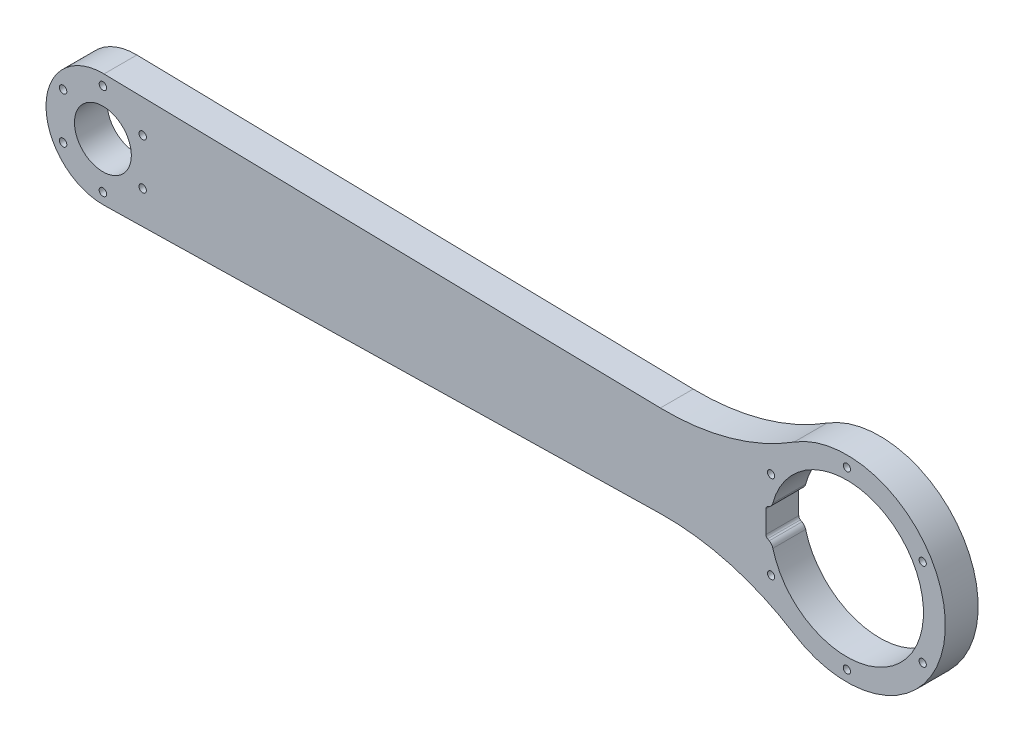
ISO-10303-21;
HEADER;
FILE_DESCRIPTION(('STEP AP214'),'2;1');
FILE_NAME('part.step','',(''),(''),'','','');
FILE_SCHEMA(('AUTOMOTIVE_DESIGN { 1 0 10303 214 1 1 1 1 }'));
ENDSEC;
DATA;
#1=APPLICATION_CONTEXT('core data for automotive mechanical design processes');
#2=APPLICATION_PROTOCOL_DEFINITION('international standard','automotive_design',2000,#1);
#3=PRODUCT_CONTEXT('',#1,'mechanical');
#4=PRODUCT('Part','Part','',(#3));
#5=PRODUCT_RELATED_PRODUCT_CATEGORY('part','',(#4));
#6=PRODUCT_DEFINITION_FORMATION('','',#4);
#7=PRODUCT_DEFINITION_CONTEXT('part definition',#1,'design');
#8=PRODUCT_DEFINITION('design','',#6,#7);
#9=PRODUCT_DEFINITION_SHAPE('','',#8);
#10=(LENGTH_UNIT() NAMED_UNIT(*) SI_UNIT(.MILLI.,.METRE.));
#11=(NAMED_UNIT(*) PLANE_ANGLE_UNIT() SI_UNIT($,.RADIAN.));
#12=(NAMED_UNIT(*) SI_UNIT($,.STERADIAN.) SOLID_ANGLE_UNIT());
#13=UNCERTAINTY_MEASURE_WITH_UNIT(LENGTH_MEASURE(1.E-05),#10,'distance_accuracy_value','');
#14=(GEOMETRIC_REPRESENTATION_CONTEXT(3) GLOBAL_UNCERTAINTY_ASSIGNED_CONTEXT((#13)) GLOBAL_UNIT_ASSIGNED_CONTEXT((#10,
#11,#12)) REPRESENTATION_CONTEXT('',''));
#15=CARTESIAN_POINT('',(0.,0.,0.));
#16=DIRECTION('',(0.,0.,1.));
#17=DIRECTION('',(1.,0.,0.));
#18=AXIS2_PLACEMENT_3D('',#15,#16,#17);
#19=CARTESIAN_POINT('',(-340.,0.,15.));
#20=DIRECTION('',(0.,0.,1.));
#21=DIRECTION('',(1.,0.,0.));
#22=AXIS2_PLACEMENT_3D('',#19,#20,#21);
#23=PLANE('',#22);
#24=CARTESIAN_POINT('',(-340.,21.,15.));
#25=DIRECTION('',(0.,0.,1.));
#26=DIRECTION('',(1.,0.,0.));
#27=AXIS2_PLACEMENT_3D('',#24,#25,#26);
#28=CIRCLE('',#27,1.69999999999996);
#29=CARTESIAN_POINT('',(-338.3,21.,15.));
#30=VERTEX_POINT('',#29);
#31=EDGE_CURVE('E432',#30,#30,#28,.T.);
#32=ORIENTED_EDGE('',*,*,#31,.F.);
#33=EDGE_LOOP('',(#32));
#34=FACE_BOUND('',#33,.T.);
#35=CARTESIAN_POINT('',(-340.,-21.,15.));
#36=DIRECTION('',(0.,0.,1.));
#37=DIRECTION('',(1.,0.,0.));
#38=AXIS2_PLACEMENT_3D('',#35,#36,#37);
#39=CIRCLE('',#38,1.69999999999996);
#40=CARTESIAN_POINT('',(-338.3,-21.,15.));
#41=VERTEX_POINT('',#40);
#42=EDGE_CURVE('E444',#41,#41,#39,.T.);
#43=ORIENTED_EDGE('',*,*,#42,.F.);
#44=EDGE_LOOP('',(#43));
#45=FACE_BOUND('',#44,.T.);
#46=CARTESIAN_POINT('',(0.,0.,15.));
#47=DIRECTION('',(0.,0.,1.));
#48=DIRECTION('',(-1.,0.,0.));
#49=AXIS2_PLACEMENT_3D('',#46,#47,#48);
#50=CIRCLE('',#49,35.);
#51=CARTESIAN_POINT('',(-33.8381250940962,-8.94322593454391,15.));
#52=VERTEX_POINT('',#51);
#53=CARTESIAN_POINT('',(-33.8381250940962,8.94322593454391,15.));
#54=VERTEX_POINT('',#53);
#55=EDGE_CURVE('E146',#52,#54,#50,.T.);
#56=ORIENTED_EDGE('',*,*,#55,.F.);
#57=CARTESIAN_POINT('',(-37.2219376035058,-9.8375485279983,15.));
#58=DIRECTION('',(0.,0.,-1.));
#59=DIRECTION('',(-1.,0.,0.));
#60=AXIS2_PLACEMENT_3D('',#57,#58,#59);
#61=CIRCLE('',#60,3.5);
#62=CARTESIAN_POINT('',(-35.5000514131056,-6.79040101806231,15.));
#63=VERTEX_POINT('',#62);
#64=EDGE_CURVE('E138',#63,#52,#61,.T.);
#65=ORIENTED_EDGE('',*,*,#64,.F.);
#66=DIRECTION('',(0.870613574267425,-0.491967482971486,0.));
#67=VECTOR('',#66,1.);
#68=CARTESIAN_POINT('',(-35.5000514131056,-6.79040101806231,15.));
#69=LINE('',#68,#67);
#70=CARTESIAN_POINT('',(-36.2379512244572,-6.37342760574069,15.));
#71=VERTEX_POINT('',#70);
#72=EDGE_CURVE('E173',#71,#63,#69,.T.);
#73=ORIENTED_EDGE('',*,*,#72,.F.);
#74=CARTESIAN_POINT('',(-35.5,-5.06750724433956,15.));
#75=DIRECTION('',(0.,0.,1.));
#76=DIRECTION('',(-1.,0.,0.));
#77=AXIS2_PLACEMENT_3D('',#74,#75,#76);
#78=CIRCLE('',#77,1.5);
#79=CARTESIAN_POINT('',(-37.,-5.06750724433956,15.));
#80=VERTEX_POINT('',#79);
#81=EDGE_CURVE('E171',#80,#71,#78,.T.);
#82=ORIENTED_EDGE('',*,*,#81,.F.);
#83=DIRECTION('',(0.,-1.,0.));
#84=VECTOR('',#83,1.);
#85=CARTESIAN_POINT('',(-37.,5.06750724433955,15.));
#86=LINE('',#85,#84);
#87=CARTESIAN_POINT('',(-37.,5.06750724433955,15.));
#88=VERTEX_POINT('',#87);
#89=EDGE_CURVE('E169',#88,#80,#86,.T.);
#90=ORIENTED_EDGE('',*,*,#89,.F.);
#91=CARTESIAN_POINT('',(-35.5,5.06750724433956,15.));
#92=DIRECTION('',(0.,0.,1.));
#93=DIRECTION('',(1.,0.,0.));
#94=AXIS2_PLACEMENT_3D('',#91,#92,#93);
#95=CIRCLE('',#94,1.5);
#96=CARTESIAN_POINT('',(-36.2379512244572,6.3734276057407,15.));
#97=VERTEX_POINT('',#96);
#98=EDGE_CURVE('E167',#97,#88,#95,.T.);
#99=ORIENTED_EDGE('',*,*,#98,.F.);
#100=DIRECTION('',(-0.870613574267423,-0.491967482971489,0.));
#101=VECTOR('',#100,1.);
#102=CARTESIAN_POINT('',(-35.5000514131056,6.79040101806231,15.));
#103=LINE('',#102,#101);
#104=CARTESIAN_POINT('',(-35.5000514131056,6.79040101806231,15.));
#105=VERTEX_POINT('',#104);
#106=EDGE_CURVE('E162',#105,#97,#103,.T.);
#107=ORIENTED_EDGE('',*,*,#106,.F.);
#108=CARTESIAN_POINT('',(-37.2219376035058,9.8375485279983,15.));
#109=DIRECTION('',(0.,0.,-1.));
#110=DIRECTION('',(-1.,0.,0.));
#111=AXIS2_PLACEMENT_3D('',#108,#109,#110);
#112=CIRCLE('',#111,3.5);
#113=EDGE_CURVE('E160',#54,#105,#112,.T.);
#114=ORIENTED_EDGE('',*,*,#113,.F.);
#115=EDGE_LOOP('',(#56,#65,#73,#82,#90,#99,#107,#114));
#116=FACE_BOUND('',#115,.T.);
#117=CARTESIAN_POINT('',(-358.186533479473,10.5,15.));
#118=DIRECTION('',(0.,0.,1.));
#119=DIRECTION('',(1.,0.,0.));
#120=AXIS2_PLACEMENT_3D('',#117,#118,#119);
#121=CIRCLE('',#120,1.69999999999996);
#122=CARTESIAN_POINT('',(-356.486533479473,10.5,15.));
#123=VERTEX_POINT('',#122);
#124=EDGE_CURVE('E206',#123,#123,#121,.T.);
#125=ORIENTED_EDGE('',*,*,#124,.F.);
#126=EDGE_LOOP('',(#125));
#127=FACE_BOUND('',#126,.T.);
#128=CARTESIAN_POINT('',(-34.6410161513775,-20.,15.));
#129=DIRECTION('',(0.,0.,1.));
#130=DIRECTION('',(1.,0.,0.));
#131=AXIS2_PLACEMENT_3D('',#128,#129,#130);
#132=CIRCLE('',#131,1.64999999999994);
#133=CARTESIAN_POINT('',(-32.9910161513776,-20.,15.));
#134=VERTEX_POINT('',#133);
#135=EDGE_CURVE('E218',#134,#134,#132,.T.);
#136=ORIENTED_EDGE('',*,*,#135,.F.);
#137=EDGE_LOOP('',(#136));
#138=FACE_BOUND('',#137,.T.);
#139=CARTESIAN_POINT('',(4.21971692985525E-13,-40.,15.));
#140=DIRECTION('',(0.,0.,1.));
#141=DIRECTION('',(1.,0.,0.));
#142=AXIS2_PLACEMENT_3D('',#139,#140,#141);
#143=CIRCLE('',#142,1.65);
#144=CARTESIAN_POINT('',(1.65000000000042,-40.,15.));
#145=VERTEX_POINT('',#144);
#146=EDGE_CURVE('E230',#145,#145,#143,.T.);
#147=ORIENTED_EDGE('',*,*,#146,.F.);
#148=EDGE_LOOP('',(#147));
#149=FACE_BOUND('',#148,.T.);
#150=CARTESIAN_POINT('',(34.6410161513775,20.,15.));
#151=DIRECTION('',(0.,0.,1.));
#152=DIRECTION('',(1.,0.,0.));
#153=AXIS2_PLACEMENT_3D('',#150,#151,#152);
#154=CIRCLE('',#153,1.65);
#155=CARTESIAN_POINT('',(36.2910161513775,20.,15.));
#156=VERTEX_POINT('',#155);
#157=EDGE_CURVE('E242',#156,#156,#154,.T.);
#158=ORIENTED_EDGE('',*,*,#157,.F.);
#159=EDGE_LOOP('',(#158));
#160=FACE_BOUND('',#159,.T.);
#161=CARTESIAN_POINT('',(-340.,0.,15.));
#162=DIRECTION('',(0.,0.,1.));
#163=DIRECTION('',(1.,0.,0.));
#164=AXIS2_PLACEMENT_3D('',#161,#162,#163);
#165=CIRCLE('',#164,26.);
#166=CARTESIAN_POINT('',(-339.479111623952,25.9947816936342,15.));
#167=VERTEX_POINT('',#166);
#168=CARTESIAN_POINT('',(-339.479111623952,-25.9947816936342,15.));
#169=VERTEX_POINT('',#168);
#170=EDGE_CURVE('E254',#167,#169,#165,.T.);
#171=ORIENTED_EDGE('',*,*,#170,.T.);
#172=DIRECTION('',(0.999799295909007,0.0200341683095325,0.));
#173=VECTOR('',#172,1.);
#174=CARTESIAN_POINT('',(-85.2451135374465,-20.9003925212157,15.));
#175=LINE('',#174,#173);
#176=CARTESIAN_POINT('',(-85.2451135374465,-20.9003925212157,15.));
#177=VERTEX_POINT('',#176);
#178=EDGE_CURVE('E257',#169,#177,#175,.T.);
#179=ORIENTED_EDGE('',*,*,#178,.T.);
#180=CARTESIAN_POINT('',(-83.0413550233979,-130.878315071206,15.));
#181=DIRECTION('',(0.,0.,-1.));
#182=DIRECTION('',(-1.,0.,0.));
#183=AXIS2_PLACEMENT_3D('',#180,#181,#182);
#184=CIRCLE('',#183,110.);
#185=CARTESIAN_POINT('',(-24.1087804906639,-37.9969301819631,15.));
#186=VERTEX_POINT('',#185);
#187=EDGE_CURVE('E260',#177,#186,#184,.T.);
#188=ORIENTED_EDGE('',*,*,#187,.T.);
#189=CARTESIAN_POINT('',(0.,0.,15.));
#190=DIRECTION('',(0.,0.,1.));
#191=DIRECTION('',(-1.,0.,0.));
#192=AXIS2_PLACEMENT_3D('',#189,#190,#191);
#193=CIRCLE('',#192,45.);
#194=CARTESIAN_POINT('',(-24.1087804906639,37.9969301819632,15.));
#195=VERTEX_POINT('',#194);
#196=EDGE_CURVE('E262',#186,#195,#193,.T.);
#197=ORIENTED_EDGE('',*,*,#196,.T.);
#198=CARTESIAN_POINT('',(-83.0413550233979,130.878315071206,15.));
#199=DIRECTION('',(0.,0.,-1.));
#200=DIRECTION('',(-1.,0.,0.));
#201=AXIS2_PLACEMENT_3D('',#198,#199,#200);
#202=CIRCLE('',#201,110.);
#203=CARTESIAN_POINT('',(-85.2451135374464,20.9003925212157,15.));
#204=VERTEX_POINT('',#203);
#205=EDGE_CURVE('E264',#195,#204,#202,.T.);
#206=ORIENTED_EDGE('',*,*,#205,.T.);
#207=DIRECTION('',(-0.999799295909007,0.0200341683095325,0.));
#208=VECTOR('',#207,1.);
#209=CARTESIAN_POINT('',(-85.2451135374465,20.9003925212157,15.));
#210=LINE('',#209,#208);
#211=EDGE_CURVE('E266',#204,#167,#210,.T.);
#212=ORIENTED_EDGE('',*,*,#211,.T.);
#213=EDGE_LOOP('',(#171,#179,#188,#197,#206,#212));
#214=FACE_BOUND('',#213,.T.);
#215=CARTESIAN_POINT('',(-1.39107268084413E-13,40.,15.));
#216=DIRECTION('',(0.,0.,1.));
#217=DIRECTION('',(1.,0.,0.));
#218=AXIS2_PLACEMENT_3D('',#215,#216,#217);
#219=CIRCLE('',#218,1.65);
#220=CARTESIAN_POINT('',(1.64999999999986,40.,15.));
#221=VERTEX_POINT('',#220);
#222=EDGE_CURVE('E248',#221,#221,#219,.T.);
#223=ORIENTED_EDGE('',*,*,#222,.F.);
#224=EDGE_LOOP('',(#223));
#225=FACE_BOUND('',#224,.T.);
#226=CARTESIAN_POINT('',(34.6410161513778,-19.9999999999996,15.));
#227=DIRECTION('',(0.,0.,1.));
#228=DIRECTION('',(1.,0.,0.));
#229=AXIS2_PLACEMENT_3D('',#226,#227,#228);
#230=CIRCLE('',#229,1.65);
#231=CARTESIAN_POINT('',(36.2910161513778,-19.9999999999996,15.));
#232=VERTEX_POINT('',#231);
#233=EDGE_CURVE('E236',#232,#232,#230,.T.);
#234=ORIENTED_EDGE('',*,*,#233,.F.);
#235=EDGE_LOOP('',(#234));
#236=FACE_BOUND('',#235,.T.);
#237=CARTESIAN_POINT('',(-34.6410161513777,20.,15.));
#238=DIRECTION('',(0.,0.,1.));
#239=DIRECTION('',(1.,0.,0.));
#240=AXIS2_PLACEMENT_3D('',#237,#238,#239);
#241=CIRCLE('',#240,1.65);
#242=CARTESIAN_POINT('',(-32.9910161513777,20.,15.));
#243=VERTEX_POINT('',#242);
#244=EDGE_CURVE('E224',#243,#243,#241,.T.);
#245=ORIENTED_EDGE('',*,*,#244,.F.);
#246=EDGE_LOOP('',(#245));
#247=FACE_BOUND('',#246,.T.);
#248=CARTESIAN_POINT('',(-340.,0.,15.));
#249=DIRECTION('',(0.,0.,1.));
#250=DIRECTION('',(1.,0.,0.));
#251=AXIS2_PLACEMENT_3D('',#248,#249,#250);
#252=CIRCLE('',#251,13.);
#253=CARTESIAN_POINT('',(-327.,0.,15.));
#254=VERTEX_POINT('',#253);
#255=EDGE_CURVE('E212',#254,#254,#252,.T.);
#256=ORIENTED_EDGE('',*,*,#255,.F.);
#257=EDGE_LOOP('',(#256));
#258=FACE_BOUND('',#257,.T.);
#259=CARTESIAN_POINT('',(-358.186533479473,-10.5,15.));
#260=DIRECTION('',(0.,0.,1.));
#261=DIRECTION('',(1.,0.,0.));
#262=AXIS2_PLACEMENT_3D('',#259,#260,#261);
#263=CIRCLE('',#262,1.69999999999996);
#264=CARTESIAN_POINT('',(-356.486533479473,-10.5,15.));
#265=VERTEX_POINT('',#264);
#266=EDGE_CURVE('E176',#265,#265,#263,.T.);
#267=ORIENTED_EDGE('',*,*,#266,.F.);
#268=EDGE_LOOP('',(#267));
#269=FACE_BOUND('',#268,.T.);
#270=CARTESIAN_POINT('',(-321.813466520527,-10.5,15.));
#271=DIRECTION('',(0.,0.,1.));
#272=DIRECTION('',(1.,0.,0.));
#273=AXIS2_PLACEMENT_3D('',#270,#271,#272);
#274=CIRCLE('',#273,1.69999999999996);
#275=CARTESIAN_POINT('',(-320.113466520527,-10.5,15.));
#276=VERTEX_POINT('',#275);
#277=EDGE_CURVE('E438',#276,#276,#274,.T.);
#278=ORIENTED_EDGE('',*,*,#277,.F.);
#279=EDGE_LOOP('',(#278));
#280=FACE_BOUND('',#279,.T.);
#281=CARTESIAN_POINT('',(-321.813466520527,10.5000000000001,15.));
#282=DIRECTION('',(0.,0.,1.));
#283=DIRECTION('',(1.,0.,0.));
#284=AXIS2_PLACEMENT_3D('',#281,#282,#283);
#285=CIRCLE('',#284,1.69999999999996);
#286=CARTESIAN_POINT('',(-320.113466520527,10.5000000000001,15.));
#287=VERTEX_POINT('',#286);
#288=EDGE_CURVE('E423',#287,#287,#285,.T.);
#289=ORIENTED_EDGE('',*,*,#288,.F.);
#290=EDGE_LOOP('',(#289));
#291=FACE_BOUND('',#290,.T.);
#292=ADVANCED_FACE('F37',(#34,#45,#116,#127,#138,#149,#160,#214,#225,#236,#247,#258,#269,#280,
#291),#23,.T.);
#293=CARTESIAN_POINT('',(-340.,0.,0.));
#294=DIRECTION('',(0.,0.,1.));
#295=DIRECTION('',(1.,0.,0.));
#296=AXIS2_PLACEMENT_3D('',#293,#294,#295);
#297=PLANE('',#296);
#298=CARTESIAN_POINT('',(-358.186533479473,10.5,0.));
#299=DIRECTION('',(0.,0.,1.));
#300=DIRECTION('',(1.,0.,0.));
#301=AXIS2_PLACEMENT_3D('',#298,#299,#300);
#302=CIRCLE('',#301,1.69999999999996);
#303=CARTESIAN_POINT('',(-356.486533479473,10.5,0.));
#304=VERTEX_POINT('',#303);
#305=EDGE_CURVE('E154',#304,#304,#302,.T.);
#306=ORIENTED_EDGE('',*,*,#305,.T.);
#307=EDGE_LOOP('',(#306));
#308=FACE_BOUND('',#307,.T.);
#309=CARTESIAN_POINT('',(-340.,0.,0.));
#310=DIRECTION('',(0.,0.,1.));
#311=DIRECTION('',(1.,0.,0.));
#312=AXIS2_PLACEMENT_3D('',#309,#310,#311);
#313=CIRCLE('',#312,13.);
#314=CARTESIAN_POINT('',(-327.,0.,0.));
#315=VERTEX_POINT('',#314);
#316=EDGE_CURVE('E209',#315,#315,#313,.T.);
#317=ORIENTED_EDGE('',*,*,#316,.T.);
#318=EDGE_LOOP('',(#317));
#319=FACE_BOUND('',#318,.T.);
#320=CARTESIAN_POINT('',(-34.6410161513775,-20.,0.));
#321=DIRECTION('',(0.,0.,1.));
#322=DIRECTION('',(1.,0.,0.));
#323=AXIS2_PLACEMENT_3D('',#320,#321,#322);
#324=CIRCLE('',#323,1.64999999999994);
#325=CARTESIAN_POINT('',(-32.9910161513776,-20.,0.));
#326=VERTEX_POINT('',#325);
#327=EDGE_CURVE('E215',#326,#326,#324,.T.);
#328=ORIENTED_EDGE('',*,*,#327,.T.);
#329=EDGE_LOOP('',(#328));
#330=FACE_BOUND('',#329,.T.);
#331=CARTESIAN_POINT('',(-34.6410161513777,20.,0.));
#332=DIRECTION('',(0.,0.,1.));
#333=DIRECTION('',(1.,0.,0.));
#334=AXIS2_PLACEMENT_3D('',#331,#332,#333);
#335=CIRCLE('',#334,1.65);
#336=CARTESIAN_POINT('',(-32.9910161513777,20.,0.));
#337=VERTEX_POINT('',#336);
#338=EDGE_CURVE('E221',#337,#337,#335,.T.);
#339=ORIENTED_EDGE('',*,*,#338,.T.);
#340=EDGE_LOOP('',(#339));
#341=FACE_BOUND('',#340,.T.);
#342=CARTESIAN_POINT('',(4.21971692985525E-13,-40.,0.));
#343=DIRECTION('',(0.,0.,1.));
#344=DIRECTION('',(1.,0.,0.));
#345=AXIS2_PLACEMENT_3D('',#342,#343,#344);
#346=CIRCLE('',#345,1.65);
#347=CARTESIAN_POINT('',(1.65000000000042,-40.,0.));
#348=VERTEX_POINT('',#347);
#349=EDGE_CURVE('E227',#348,#348,#346,.T.);
#350=ORIENTED_EDGE('',*,*,#349,.T.);
#351=EDGE_LOOP('',(#350));
#352=FACE_BOUND('',#351,.T.);
#353=CARTESIAN_POINT('',(34.6410161513778,-19.9999999999996,0.));
#354=DIRECTION('',(0.,0.,1.));
#355=DIRECTION('',(1.,0.,0.));
#356=AXIS2_PLACEMENT_3D('',#353,#354,#355);
#357=CIRCLE('',#356,1.65);
#358=CARTESIAN_POINT('',(36.2910161513778,-19.9999999999996,0.));
#359=VERTEX_POINT('',#358);
#360=EDGE_CURVE('E233',#359,#359,#357,.T.);
#361=ORIENTED_EDGE('',*,*,#360,.T.);
#362=EDGE_LOOP('',(#361));
#363=FACE_BOUND('',#362,.T.);
#364=CARTESIAN_POINT('',(34.6410161513775,20.,0.));
#365=DIRECTION('',(0.,0.,1.));
#366=DIRECTION('',(1.,0.,0.));
#367=AXIS2_PLACEMENT_3D('',#364,#365,#366);
#368=CIRCLE('',#367,1.65);
#369=CARTESIAN_POINT('',(36.2910161513775,20.,0.));
#370=VERTEX_POINT('',#369);
#371=EDGE_CURVE('E239',#370,#370,#368,.T.);
#372=ORIENTED_EDGE('',*,*,#371,.T.);
#373=EDGE_LOOP('',(#372));
#374=FACE_BOUND('',#373,.T.);
#375=CARTESIAN_POINT('',(-1.39107268084413E-13,40.,0.));
#376=DIRECTION('',(0.,0.,1.));
#377=DIRECTION('',(1.,0.,0.));
#378=AXIS2_PLACEMENT_3D('',#375,#376,#377);
#379=CIRCLE('',#378,1.65);
#380=CARTESIAN_POINT('',(1.64999999999986,40.,0.));
#381=VERTEX_POINT('',#380);
#382=EDGE_CURVE('E245',#381,#381,#379,.T.);
#383=ORIENTED_EDGE('',*,*,#382,.T.);
#384=EDGE_LOOP('',(#383));
#385=FACE_BOUND('',#384,.T.);
#386=CARTESIAN_POINT('',(-340.,0.,0.));
#387=DIRECTION('',(0.,0.,1.));
#388=DIRECTION('',(1.,0.,0.));
#389=AXIS2_PLACEMENT_3D('',#386,#387,#388);
#390=CIRCLE('',#389,26.);
#391=CARTESIAN_POINT('',(-339.479111623952,25.9947816936342,0.));
#392=VERTEX_POINT('',#391);
#393=CARTESIAN_POINT('',(-339.479111623952,-25.9947816936342,0.));
#394=VERTEX_POINT('',#393);
#395=EDGE_CURVE('E251',#392,#394,#390,.T.);
#396=ORIENTED_EDGE('',*,*,#395,.F.);
#397=DIRECTION('',(-0.999799295909007,0.0200341683095325,0.));
#398=VECTOR('',#397,1.);
#399=CARTESIAN_POINT('',(-85.2451135374465,20.9003925212157,0.));
#400=LINE('',#399,#398);
#401=CARTESIAN_POINT('',(-85.2451135374464,20.9003925212157,0.));
#402=VERTEX_POINT('',#401);
#403=EDGE_CURVE('E258',#402,#392,#400,.T.);
#404=ORIENTED_EDGE('',*,*,#403,.F.);
#405=CARTESIAN_POINT('',(-83.0413550233979,130.878315071206,0.));
#406=DIRECTION('',(0.,0.,-1.));
#407=DIRECTION('',(-1.,0.,0.));
#408=AXIS2_PLACEMENT_3D('',#405,#406,#407);
#409=CIRCLE('',#408,110.);
#410=CARTESIAN_POINT('',(-24.1087804906639,37.9969301819632,0.));
#411=VERTEX_POINT('',#410);
#412=EDGE_CURVE('E277',#411,#402,#409,.T.);
#413=ORIENTED_EDGE('',*,*,#412,.F.);
#414=CARTESIAN_POINT('',(0.,0.,0.));
#415=DIRECTION('',(0.,0.,1.));
#416=DIRECTION('',(-1.,0.,0.));
#417=AXIS2_PLACEMENT_3D('',#414,#415,#416);
#418=CIRCLE('',#417,45.);
#419=CARTESIAN_POINT('',(-24.1087804906639,-37.9969301819631,0.));
#420=VERTEX_POINT('',#419);
#421=EDGE_CURVE('E275',#420,#411,#418,.T.);
#422=ORIENTED_EDGE('',*,*,#421,.F.);
#423=CARTESIAN_POINT('',(-83.0413550233979,-130.878315071206,0.));
#424=DIRECTION('',(0.,0.,-1.));
#425=DIRECTION('',(-1.,0.,0.));
#426=AXIS2_PLACEMENT_3D('',#423,#424,#425);
#427=CIRCLE('',#426,110.);
#428=CARTESIAN_POINT('',(-85.2451135374465,-20.9003925212157,0.));
#429=VERTEX_POINT('',#428);
#430=EDGE_CURVE('E273',#429,#420,#427,.T.);
#431=ORIENTED_EDGE('',*,*,#430,.F.);
#432=DIRECTION('',(0.999799295909007,0.0200341683095325,0.));
#433=VECTOR('',#432,1.);
#434=CARTESIAN_POINT('',(-85.2451135374465,-20.9003925212157,0.));
#435=LINE('',#434,#433);
#436=EDGE_CURVE('E271',#394,#429,#435,.T.);
#437=ORIENTED_EDGE('',*,*,#436,.F.);
#438=EDGE_LOOP('',(#396,#404,#413,#422,#431,#437));
#439=FACE_BOUND('',#438,.T.);
#440=CARTESIAN_POINT('',(-37.2219376035058,-9.8375485279983,0.));
#441=DIRECTION('',(0.,0.,-1.));
#442=DIRECTION('',(-1.,0.,0.));
#443=AXIS2_PLACEMENT_3D('',#440,#441,#442);
#444=CIRCLE('',#443,3.5);
#445=CARTESIAN_POINT('',(-35.5000514131056,-6.7904010180623,0.));
#446=VERTEX_POINT('',#445);
#447=CARTESIAN_POINT('',(-33.8381250940962,-8.94322593454391,0.));
#448=VERTEX_POINT('',#447);
#449=EDGE_CURVE('E60',#446,#448,#444,.T.);
#450=ORIENTED_EDGE('',*,*,#449,.T.);
#451=CARTESIAN_POINT('',(0.,0.,0.));
#452=DIRECTION('',(0.,0.,1.));
#453=DIRECTION('',(-1.,0.,0.));
#454=AXIS2_PLACEMENT_3D('',#451,#452,#453);
#455=CIRCLE('',#454,35.);
#456=CARTESIAN_POINT('',(-33.8381250940962,8.94322593454391,0.));
#457=VERTEX_POINT('',#456);
#458=EDGE_CURVE('E153',#448,#457,#455,.T.);
#459=ORIENTED_EDGE('',*,*,#458,.T.);
#460=CARTESIAN_POINT('',(-37.2219376035058,9.8375485279983,0.));
#461=DIRECTION('',(0.,0.,-1.));
#462=DIRECTION('',(-1.,0.,0.));
#463=AXIS2_PLACEMENT_3D('',#460,#461,#462);
#464=CIRCLE('',#463,3.5);
#465=CARTESIAN_POINT('',(-35.5000514131056,6.79040101806231,0.));
#466=VERTEX_POINT('',#465);
#467=EDGE_CURVE('E178',#457,#466,#464,.T.);
#468=ORIENTED_EDGE('',*,*,#467,.T.);
#469=DIRECTION('',(-0.870613574267423,-0.491967482971489,0.));
#470=VECTOR('',#469,1.);
#471=CARTESIAN_POINT('',(-35.5000514131056,6.79040101806231,0.));
#472=LINE('',#471,#470);
#473=CARTESIAN_POINT('',(-36.2379512244572,6.3734276057407,0.));
#474=VERTEX_POINT('',#473);
#475=EDGE_CURVE('E181',#466,#474,#472,.T.);
#476=ORIENTED_EDGE('',*,*,#475,.T.);
#477=CARTESIAN_POINT('',(-35.5,5.06750724433956,0.));
#478=DIRECTION('',(0.,0.,1.));
#479=DIRECTION('',(1.,0.,0.));
#480=AXIS2_PLACEMENT_3D('',#477,#478,#479);
#481=CIRCLE('',#480,1.5);
#482=CARTESIAN_POINT('',(-37.,5.06750724433955,0.));
#483=VERTEX_POINT('',#482);
#484=EDGE_CURVE('E184',#474,#483,#481,.T.);
#485=ORIENTED_EDGE('',*,*,#484,.T.);
#486=DIRECTION('',(0.,-1.,0.));
#487=VECTOR('',#486,1.);
#488=CARTESIAN_POINT('',(-37.,5.06750724433955,0.));
#489=LINE('',#488,#487);
#490=CARTESIAN_POINT('',(-37.,-5.06750724433956,0.));
#491=VERTEX_POINT('',#490);
#492=EDGE_CURVE('E187',#483,#491,#489,.T.);
#493=ORIENTED_EDGE('',*,*,#492,.T.);
#494=CARTESIAN_POINT('',(-35.5,-5.06750724433956,0.));
#495=DIRECTION('',(0.,0.,1.));
#496=DIRECTION('',(-1.,0.,0.));
#497=AXIS2_PLACEMENT_3D('',#494,#495,#496);
#498=CIRCLE('',#497,1.5);
#499=CARTESIAN_POINT('',(-36.2379512244572,-6.3734276057407,0.));
#500=VERTEX_POINT('',#499);
#501=EDGE_CURVE('E190',#491,#500,#498,.T.);
#502=ORIENTED_EDGE('',*,*,#501,.T.);
#503=DIRECTION('',(0.870613574267425,-0.491967482971486,0.));
#504=VECTOR('',#503,1.);
#505=CARTESIAN_POINT('',(-35.5000514131056,-6.79040101806231,0.));
#506=LINE('',#505,#504);
#507=EDGE_CURVE('E147',#500,#446,#506,.T.);
#508=ORIENTED_EDGE('',*,*,#507,.T.);
#509=EDGE_LOOP('',(#450,#459,#468,#476,#485,#493,#502,#508));
#510=FACE_BOUND('',#509,.T.);
#511=CARTESIAN_POINT('',(-358.186533479473,-10.5,0.));
#512=DIRECTION('',(0.,0.,1.));
#513=DIRECTION('',(1.,0.,0.));
#514=AXIS2_PLACEMENT_3D('',#511,#512,#513);
#515=CIRCLE('',#514,1.69999999999996);
#516=CARTESIAN_POINT('',(-356.486533479473,-10.5,0.));
#517=VERTEX_POINT('',#516);
#518=EDGE_CURVE('E447',#517,#517,#515,.T.);
#519=ORIENTED_EDGE('',*,*,#518,.T.);
#520=EDGE_LOOP('',(#519));
#521=FACE_BOUND('',#520,.T.);
#522=CARTESIAN_POINT('',(-340.,-21.,0.));
#523=DIRECTION('',(0.,0.,1.));
#524=DIRECTION('',(1.,0.,0.));
#525=AXIS2_PLACEMENT_3D('',#522,#523,#524);
#526=CIRCLE('',#525,1.69999999999996);
#527=CARTESIAN_POINT('',(-338.3,-21.,0.));
#528=VERTEX_POINT('',#527);
#529=EDGE_CURVE('E441',#528,#528,#526,.T.);
#530=ORIENTED_EDGE('',*,*,#529,.T.);
#531=EDGE_LOOP('',(#530));
#532=FACE_BOUND('',#531,.T.);
#533=CARTESIAN_POINT('',(-321.813466520527,-10.5,0.));
#534=DIRECTION('',(0.,0.,1.));
#535=DIRECTION('',(1.,0.,0.));
#536=AXIS2_PLACEMENT_3D('',#533,#534,#535);
#537=CIRCLE('',#536,1.69999999999996);
#538=CARTESIAN_POINT('',(-320.113466520527,-10.5,0.));
#539=VERTEX_POINT('',#538);
#540=EDGE_CURVE('E435',#539,#539,#537,.T.);
#541=ORIENTED_EDGE('',*,*,#540,.T.);
#542=EDGE_LOOP('',(#541));
#543=FACE_BOUND('',#542,.T.);
#544=CARTESIAN_POINT('',(-340.,21.,0.));
#545=DIRECTION('',(0.,0.,1.));
#546=DIRECTION('',(1.,0.,0.));
#547=AXIS2_PLACEMENT_3D('',#544,#545,#546);
#548=CIRCLE('',#547,1.69999999999996);
#549=CARTESIAN_POINT('',(-338.3,21.,0.));
#550=VERTEX_POINT('',#549);
#551=EDGE_CURVE('E429',#550,#550,#548,.T.);
#552=ORIENTED_EDGE('',*,*,#551,.T.);
#553=EDGE_LOOP('',(#552));
#554=FACE_BOUND('',#553,.T.);
#555=CARTESIAN_POINT('',(-321.813466520527,10.5000000000001,0.));
#556=DIRECTION('',(0.,0.,1.));
#557=DIRECTION('',(1.,0.,0.));
#558=AXIS2_PLACEMENT_3D('',#555,#556,#557);
#559=CIRCLE('',#558,1.69999999999996);
#560=CARTESIAN_POINT('',(-320.113466520527,10.5000000000001,0.));
#561=VERTEX_POINT('',#560);
#562=EDGE_CURVE('E426',#561,#561,#559,.T.);
#563=ORIENTED_EDGE('',*,*,#562,.T.);
#564=EDGE_LOOP('',(#563));
#565=FACE_BOUND('',#564,.T.);
#566=ADVANCED_FACE('F301',(#308,#319,#330,#341,#352,#363,#374,#385,#439,#510,#521,#532,#543,
#554,#565),#297,.F.);
#567=CARTESIAN_POINT('',(-340.,0.,15.));
#568=DIRECTION('',(0.,0.,-1.));
#569=DIRECTION('',(-1.,0.,0.));
#570=AXIS2_PLACEMENT_3D('',#567,#568,#569);
#571=CYLINDRICAL_SURFACE('',#570,26.);
#572=ORIENTED_EDGE('',*,*,#395,.T.);
#573=DIRECTION('',(0.,0.,-1.));
#574=VECTOR('',#573,1.);
#575=CARTESIAN_POINT('',(-339.479111623952,-25.9947816936342,15.));
#576=LINE('',#575,#574);
#577=EDGE_CURVE('E11',#169,#394,#576,.T.);
#578=ORIENTED_EDGE('',*,*,#577,.F.);
#579=ORIENTED_EDGE('',*,*,#170,.F.);
#580=DIRECTION('',(0.,0.,-1.));
#581=VECTOR('',#580,1.);
#582=CARTESIAN_POINT('',(-339.479111623952,25.9947816936342,15.));
#583=LINE('',#582,#581);
#584=EDGE_CURVE('E268',#167,#392,#583,.T.);
#585=ORIENTED_EDGE('',*,*,#584,.T.);
#586=EDGE_LOOP('',(#572,#578,#579,#585));
#587=FACE_BOUND('',#586,.T.);
#588=ADVANCED_FACE('F39',(#587),#571,.T.);
#589=CARTESIAN_POINT('',(-85.2451135374465,-20.9003925212157,15.));
#590=DIRECTION('',(-0.0200341683095325,0.999799295909007,0.));
#591=DIRECTION('',(-0.999799295909007,-0.0200341683095325,0.));
#592=AXIS2_PLACEMENT_3D('',#589,#590,#591);
#593=PLANE('',#592);
#594=ORIENTED_EDGE('',*,*,#436,.T.);
#595=DIRECTION('',(0.,0.,-1.));
#596=VECTOR('',#595,1.);
#597=CARTESIAN_POINT('',(-85.2451135374465,-20.9003925212157,15.));
#598=LINE('',#597,#596);
#599=EDGE_CURVE('E45',#177,#429,#598,.T.);
#600=ORIENTED_EDGE('',*,*,#599,.F.);
#601=ORIENTED_EDGE('',*,*,#178,.F.);
#602=ORIENTED_EDGE('',*,*,#577,.T.);
#603=EDGE_LOOP('',(#594,#600,#601,#602));
#604=FACE_BOUND('',#603,.T.);
#605=ADVANCED_FACE('F319',(#604),#593,.F.);
#606=CARTESIAN_POINT('',(-83.0413550233979,-130.878315071206,15.));
#607=DIRECTION('',(0.,0.,-1.));
#608=DIRECTION('',(-1.,0.,0.));
#609=AXIS2_PLACEMENT_3D('',#606,#607,#608);
#610=CYLINDRICAL_SURFACE('',#609,110.);
#611=ORIENTED_EDGE('',*,*,#430,.T.);
#612=DIRECTION('',(0.,0.,-1.));
#613=VECTOR('',#612,1.);
#614=CARTESIAN_POINT('',(-24.1087804906639,-37.9969301819631,15.));
#615=LINE('',#614,#613);
#616=EDGE_CURVE('E288',#186,#420,#615,.T.);
#617=ORIENTED_EDGE('',*,*,#616,.F.);
#618=ORIENTED_EDGE('',*,*,#187,.F.);
#619=ORIENTED_EDGE('',*,*,#599,.T.);
#620=EDGE_LOOP('',(#611,#617,#618,#619));
#621=FACE_BOUND('',#620,.T.);
#622=ADVANCED_FACE('F295',(#621),#610,.F.);
#623=CARTESIAN_POINT('',(0.,0.,15.));
#624=DIRECTION('',(0.,0.,-1.));
#625=DIRECTION('',(-1.,0.,0.));
#626=AXIS2_PLACEMENT_3D('',#623,#624,#625);
#627=CYLINDRICAL_SURFACE('',#626,45.);
#628=ORIENTED_EDGE('',*,*,#421,.T.);
#629=DIRECTION('',(0.,0.,-1.));
#630=VECTOR('',#629,1.);
#631=CARTESIAN_POINT('',(-24.1087804906639,37.9969301819632,15.));
#632=LINE('',#631,#630);
#633=EDGE_CURVE('E285',#195,#411,#632,.T.);
#634=ORIENTED_EDGE('',*,*,#633,.F.);
#635=ORIENTED_EDGE('',*,*,#196,.F.);
#636=ORIENTED_EDGE('',*,*,#616,.T.);
#637=EDGE_LOOP('',(#628,#634,#635,#636));
#638=FACE_BOUND('',#637,.T.);
#639=ADVANCED_FACE('F307',(#638),#627,.T.);
#640=CARTESIAN_POINT('',(-83.0413550233979,130.878315071206,15.));
#641=DIRECTION('',(0.,0.,-1.));
#642=DIRECTION('',(-1.,0.,0.));
#643=AXIS2_PLACEMENT_3D('',#640,#641,#642);
#644=CYLINDRICAL_SURFACE('',#643,110.);
#645=ORIENTED_EDGE('',*,*,#412,.T.);
#646=DIRECTION('',(0.,0.,-1.));
#647=VECTOR('',#646,1.);
#648=CARTESIAN_POINT('',(-85.2451135374464,20.9003925212157,15.));
#649=LINE('',#648,#647);
#650=EDGE_CURVE('E282',#204,#402,#649,.T.);
#651=ORIENTED_EDGE('',*,*,#650,.F.);
#652=ORIENTED_EDGE('',*,*,#205,.F.);
#653=ORIENTED_EDGE('',*,*,#633,.T.);
#654=EDGE_LOOP('',(#645,#651,#652,#653));
#655=FACE_BOUND('',#654,.T.);
#656=ADVANCED_FACE('F311',(#655),#644,.F.);
#657=CARTESIAN_POINT('',(-85.2451135374465,20.9003925212157,15.));
#658=DIRECTION('',(-0.0200341683095325,-0.999799295909007,0.));
#659=DIRECTION('',(0.999799295909007,-0.0200341683095325,0.));
#660=AXIS2_PLACEMENT_3D('',#657,#658,#659);
#661=PLANE('',#660);
#662=ORIENTED_EDGE('',*,*,#403,.T.);
#663=ORIENTED_EDGE('',*,*,#584,.F.);
#664=ORIENTED_EDGE('',*,*,#211,.F.);
#665=ORIENTED_EDGE('',*,*,#650,.T.);
#666=EDGE_LOOP('',(#662,#663,#664,#665));
#667=FACE_BOUND('',#666,.T.);
#668=ADVANCED_FACE('F322',(#667),#661,.F.);
#669=CARTESIAN_POINT('',(-1.39107268084413E-13,40.,15.));
#670=DIRECTION('',(0.,0.,-1.));
#671=DIRECTION('',(-1.,0.,0.));
#672=AXIS2_PLACEMENT_3D('',#669,#670,#671);
#673=CYLINDRICAL_SURFACE('',#672,1.65);
#674=ORIENTED_EDGE('',*,*,#222,.T.);
#675=EDGE_LOOP('',(#674));
#676=FACE_BOUND('',#675,.T.);
#677=ORIENTED_EDGE('',*,*,#382,.F.);
#678=EDGE_LOOP('',(#677));
#679=FACE_BOUND('',#678,.T.);
#680=ADVANCED_FACE('F324',(#676,#679),#673,.F.);
#681=CARTESIAN_POINT('',(34.6410161513775,20.,15.));
#682=DIRECTION('',(0.,0.,-1.));
#683=DIRECTION('',(-1.,0.,0.));
#684=AXIS2_PLACEMENT_3D('',#681,#682,#683);
#685=CYLINDRICAL_SURFACE('',#684,1.65);
#686=ORIENTED_EDGE('',*,*,#157,.T.);
#687=EDGE_LOOP('',(#686));
#688=FACE_BOUND('',#687,.T.);
#689=ORIENTED_EDGE('',*,*,#371,.F.);
#690=EDGE_LOOP('',(#689));
#691=FACE_BOUND('',#690,.T.);
#692=ADVANCED_FACE('F330',(#688,#691),#685,.F.);
#693=CARTESIAN_POINT('',(34.6410161513778,-19.9999999999996,15.));
#694=DIRECTION('',(0.,0.,-1.));
#695=DIRECTION('',(-1.,0.,0.));
#696=AXIS2_PLACEMENT_3D('',#693,#694,#695);
#697=CYLINDRICAL_SURFACE('',#696,1.65);
#698=ORIENTED_EDGE('',*,*,#233,.T.);
#699=EDGE_LOOP('',(#698));
#700=FACE_BOUND('',#699,.T.);
#701=ORIENTED_EDGE('',*,*,#360,.F.);
#702=EDGE_LOOP('',(#701));
#703=FACE_BOUND('',#702,.T.);
#704=ADVANCED_FACE('F347',(#700,#703),#697,.F.);
#705=CARTESIAN_POINT('',(4.21971692985525E-13,-40.,15.));
#706=DIRECTION('',(0.,0.,-1.));
#707=DIRECTION('',(-1.,0.,0.));
#708=AXIS2_PLACEMENT_3D('',#705,#706,#707);
#709=CYLINDRICAL_SURFACE('',#708,1.65);
#710=ORIENTED_EDGE('',*,*,#146,.T.);
#711=EDGE_LOOP('',(#710));
#712=FACE_BOUND('',#711,.T.);
#713=ORIENTED_EDGE('',*,*,#349,.F.);
#714=EDGE_LOOP('',(#713));
#715=FACE_BOUND('',#714,.T.);
#716=ADVANCED_FACE('F351',(#712,#715),#709,.F.);
#717=CARTESIAN_POINT('',(-34.6410161513777,20.,15.));
#718=DIRECTION('',(0.,0.,-1.));
#719=DIRECTION('',(-1.,0.,0.));
#720=AXIS2_PLACEMENT_3D('',#717,#718,#719);
#721=CYLINDRICAL_SURFACE('',#720,1.65);
#722=ORIENTED_EDGE('',*,*,#244,.T.);
#723=EDGE_LOOP('',(#722));
#724=FACE_BOUND('',#723,.T.);
#725=ORIENTED_EDGE('',*,*,#338,.F.);
#726=EDGE_LOOP('',(#725));
#727=FACE_BOUND('',#726,.T.);
#728=ADVANCED_FACE('F355',(#724,#727),#721,.F.);
#729=CARTESIAN_POINT('',(-34.6410161513775,-20.,15.));
#730=DIRECTION('',(0.,0.,-1.));
#731=DIRECTION('',(-1.,0.,0.));
#732=AXIS2_PLACEMENT_3D('',#729,#730,#731);
#733=CYLINDRICAL_SURFACE('',#732,1.64999999999994);
#734=ORIENTED_EDGE('',*,*,#135,.T.);
#735=EDGE_LOOP('',(#734));
#736=FACE_BOUND('',#735,.T.);
#737=ORIENTED_EDGE('',*,*,#327,.F.);
#738=EDGE_LOOP('',(#737));
#739=FACE_BOUND('',#738,.T.);
#740=ADVANCED_FACE('F359',(#736,#739),#733,.F.);
#741=CARTESIAN_POINT('',(-340.,0.,15.));
#742=DIRECTION('',(0.,0.,-1.));
#743=DIRECTION('',(-1.,0.,0.));
#744=AXIS2_PLACEMENT_3D('',#741,#742,#743);
#745=CYLINDRICAL_SURFACE('',#744,13.);
#746=ORIENTED_EDGE('',*,*,#255,.T.);
#747=EDGE_LOOP('',(#746));
#748=FACE_BOUND('',#747,.T.);
#749=ORIENTED_EDGE('',*,*,#316,.F.);
#750=EDGE_LOOP('',(#749));
#751=FACE_BOUND('',#750,.T.);
#752=ADVANCED_FACE('F363',(#748,#751),#745,.F.);
#753=CARTESIAN_POINT('',(-358.186533479473,10.5,15.));
#754=DIRECTION('',(0.,0.,-1.));
#755=DIRECTION('',(-1.,0.,0.));
#756=AXIS2_PLACEMENT_3D('',#753,#754,#755);
#757=CYLINDRICAL_SURFACE('',#756,1.69999999999996);
#758=ORIENTED_EDGE('',*,*,#124,.T.);
#759=EDGE_LOOP('',(#758));
#760=FACE_BOUND('',#759,.T.);
#761=ORIENTED_EDGE('',*,*,#305,.F.);
#762=EDGE_LOOP('',(#761));
#763=FACE_BOUND('',#762,.T.);
#764=ADVANCED_FACE('F367',(#760,#763),#757,.F.);
#765=CARTESIAN_POINT('',(-37.2219376035058,-9.8375485279983,15.));
#766=DIRECTION('',(0.,0.,-1.));
#767=DIRECTION('',(-1.,0.,0.));
#768=AXIS2_PLACEMENT_3D('',#765,#766,#767);
#769=CYLINDRICAL_SURFACE('',#768,3.5);
#770=ORIENTED_EDGE('',*,*,#449,.F.);
#771=DIRECTION('',(0.,0.,-1.));
#772=VECTOR('',#771,1.);
#773=CARTESIAN_POINT('',(-35.5000514131056,-6.79040101806231,15.));
#774=LINE('',#773,#772);
#775=EDGE_CURVE('E142',#63,#446,#774,.T.);
#776=ORIENTED_EDGE('',*,*,#775,.F.);
#777=ORIENTED_EDGE('',*,*,#64,.T.);
#778=DIRECTION('',(0.,0.,-1.));
#779=VECTOR('',#778,1.);
#780=CARTESIAN_POINT('',(-33.8381250940962,-8.94322593454391,15.));
#781=LINE('',#780,#779);
#782=EDGE_CURVE('E141',#52,#448,#781,.T.);
#783=ORIENTED_EDGE('',*,*,#782,.T.);
#784=EDGE_LOOP('',(#770,#776,#777,#783));
#785=FACE_BOUND('',#784,.T.);
#786=ADVANCED_FACE('F140',(#785),#769,.T.);
#787=CARTESIAN_POINT('',(0.,0.,15.));
#788=DIRECTION('',(0.,0.,-1.));
#789=DIRECTION('',(-1.,0.,0.));
#790=AXIS2_PLACEMENT_3D('',#787,#788,#789);
#791=CYLINDRICAL_SURFACE('',#790,35.);
#792=ORIENTED_EDGE('',*,*,#458,.F.);
#793=ORIENTED_EDGE('',*,*,#782,.F.);
#794=ORIENTED_EDGE('',*,*,#55,.T.);
#795=DIRECTION('',(0.,0.,-1.));
#796=VECTOR('',#795,1.);
#797=CARTESIAN_POINT('',(-33.8381250940962,8.94322593454391,15.));
#798=LINE('',#797,#796);
#799=EDGE_CURVE('E155',#54,#457,#798,.T.);
#800=ORIENTED_EDGE('',*,*,#799,.T.);
#801=EDGE_LOOP('',(#792,#793,#794,#800));
#802=FACE_BOUND('',#801,.T.);
#803=ADVANCED_FACE('F150',(#802),#791,.F.);
#804=CARTESIAN_POINT('',(-37.2219376035058,9.8375485279983,15.));
#805=DIRECTION('',(0.,0.,-1.));
#806=DIRECTION('',(-1.,0.,0.));
#807=AXIS2_PLACEMENT_3D('',#804,#805,#806);
#808=CYLINDRICAL_SURFACE('',#807,3.5);
#809=ORIENTED_EDGE('',*,*,#467,.F.);
#810=ORIENTED_EDGE('',*,*,#799,.F.);
#811=ORIENTED_EDGE('',*,*,#113,.T.);
#812=DIRECTION('',(0.,0.,-1.));
#813=VECTOR('',#812,1.);
#814=CARTESIAN_POINT('',(-35.5000514131056,6.79040101806231,15.));
#815=LINE('',#814,#813);
#816=EDGE_CURVE('E203',#105,#466,#815,.T.);
#817=ORIENTED_EDGE('',*,*,#816,.T.);
#818=EDGE_LOOP('',(#809,#810,#811,#817));
#819=FACE_BOUND('',#818,.T.);
#820=ADVANCED_FACE('F376',(#819),#808,.T.);
#821=CARTESIAN_POINT('',(-35.5000514131056,6.79040101806231,15.));
#822=DIRECTION('',(0.491967482971489,-0.870613574267423,0.));
#823=DIRECTION('',(0.870613574267423,0.491967482971489,0.));
#824=AXIS2_PLACEMENT_3D('',#821,#822,#823);
#825=PLANE('',#824);
#826=ORIENTED_EDGE('',*,*,#475,.F.);
#827=ORIENTED_EDGE('',*,*,#816,.F.);
#828=ORIENTED_EDGE('',*,*,#106,.T.);
#829=DIRECTION('',(0.,0.,-1.));
#830=VECTOR('',#829,1.);
#831=CARTESIAN_POINT('',(-36.2379512244572,6.3734276057407,15.));
#832=LINE('',#831,#830);
#833=EDGE_CURVE('E201',#97,#474,#832,.T.);
#834=ORIENTED_EDGE('',*,*,#833,.T.);
#835=EDGE_LOOP('',(#826,#827,#828,#834));
#836=FACE_BOUND('',#835,.T.);
#837=ADVANCED_FACE('F379',(#836),#825,.T.);
#838=CARTESIAN_POINT('',(-35.5,5.06750724433956,15.));
#839=DIRECTION('',(0.,0.,-1.));
#840=DIRECTION('',(-1.,0.,0.));
#841=AXIS2_PLACEMENT_3D('',#838,#839,#840);
#842=CYLINDRICAL_SURFACE('',#841,1.5);
#843=ORIENTED_EDGE('',*,*,#484,.F.);
#844=ORIENTED_EDGE('',*,*,#833,.F.);
#845=ORIENTED_EDGE('',*,*,#98,.T.);
#846=DIRECTION('',(0.,0.,-1.));
#847=VECTOR('',#846,1.);
#848=CARTESIAN_POINT('',(-37.,5.06750724433955,15.));
#849=LINE('',#848,#847);
#850=EDGE_CURVE('E199',#88,#483,#849,.T.);
#851=ORIENTED_EDGE('',*,*,#850,.T.);
#852=EDGE_LOOP('',(#843,#844,#845,#851));
#853=FACE_BOUND('',#852,.T.);
#854=ADVANCED_FACE('F383',(#853),#842,.F.);
#855=CARTESIAN_POINT('',(-37.,5.06750724433955,15.));
#856=DIRECTION('',(1.,0.,0.));
#857=DIRECTION('',(0.,0.,-1.));
#858=AXIS2_PLACEMENT_3D('',#855,#856,#857);
#859=PLANE('',#858);
#860=ORIENTED_EDGE('',*,*,#492,.F.);
#861=ORIENTED_EDGE('',*,*,#850,.F.);
#862=ORIENTED_EDGE('',*,*,#89,.T.);
#863=DIRECTION('',(0.,0.,-1.));
#864=VECTOR('',#863,1.);
#865=CARTESIAN_POINT('',(-37.,-5.06750724433956,15.));
#866=LINE('',#865,#864);
#867=EDGE_CURVE('E197',#80,#491,#866,.T.);
#868=ORIENTED_EDGE('',*,*,#867,.T.);
#869=EDGE_LOOP('',(#860,#861,#862,#868));
#870=FACE_BOUND('',#869,.T.);
#871=ADVANCED_FACE('F387',(#870),#859,.T.);
#872=CARTESIAN_POINT('',(-35.5,-5.06750724433956,15.));
#873=DIRECTION('',(0.,0.,-1.));
#874=DIRECTION('',(-1.,0.,0.));
#875=AXIS2_PLACEMENT_3D('',#872,#873,#874);
#876=CYLINDRICAL_SURFACE('',#875,1.5);
#877=ORIENTED_EDGE('',*,*,#501,.F.);
#878=ORIENTED_EDGE('',*,*,#867,.F.);
#879=ORIENTED_EDGE('',*,*,#81,.T.);
#880=DIRECTION('',(0.,0.,-1.));
#881=VECTOR('',#880,1.);
#882=CARTESIAN_POINT('',(-36.2379512244572,-6.3734276057407,15.));
#883=LINE('',#882,#881);
#884=EDGE_CURVE('E52',#71,#500,#883,.T.);
#885=ORIENTED_EDGE('',*,*,#884,.T.);
#886=EDGE_LOOP('',(#877,#878,#879,#885));
#887=FACE_BOUND('',#886,.T.);
#888=ADVANCED_FACE('F391',(#887),#876,.F.);
#889=CARTESIAN_POINT('',(-35.5000514131056,-6.79040101806231,15.));
#890=DIRECTION('',(0.491967482971486,0.870613574267425,0.));
#891=DIRECTION('',(-0.870613574267425,0.491967482971486,0.));
#892=AXIS2_PLACEMENT_3D('',#889,#890,#891);
#893=PLANE('',#892);
#894=ORIENTED_EDGE('',*,*,#507,.F.);
#895=ORIENTED_EDGE('',*,*,#884,.F.);
#896=ORIENTED_EDGE('',*,*,#72,.T.);
#897=ORIENTED_EDGE('',*,*,#775,.T.);
#898=EDGE_LOOP('',(#894,#895,#896,#897));
#899=FACE_BOUND('',#898,.T.);
#900=ADVANCED_FACE('F395',(#899),#893,.T.);
#901=CARTESIAN_POINT('',(-358.186533479473,-10.5,15.));
#902=DIRECTION('',(0.,0.,-1.));
#903=DIRECTION('',(-1.,0.,0.));
#904=AXIS2_PLACEMENT_3D('',#901,#902,#903);
#905=CYLINDRICAL_SURFACE('',#904,1.69999999999996);
#906=ORIENTED_EDGE('',*,*,#266,.T.);
#907=EDGE_LOOP('',(#906));
#908=FACE_BOUND('',#907,.T.);
#909=ORIENTED_EDGE('',*,*,#518,.F.);
#910=EDGE_LOOP('',(#909));
#911=FACE_BOUND('',#910,.T.);
#912=ADVANCED_FACE('F399',(#908,#911),#905,.F.);
#913=CARTESIAN_POINT('',(-340.,-21.,15.));
#914=DIRECTION('',(0.,0.,-1.));
#915=DIRECTION('',(-1.,0.,0.));
#916=AXIS2_PLACEMENT_3D('',#913,#914,#915);
#917=CYLINDRICAL_SURFACE('',#916,1.69999999999996);
#918=ORIENTED_EDGE('',*,*,#42,.T.);
#919=EDGE_LOOP('',(#918));
#920=FACE_BOUND('',#919,.T.);
#921=ORIENTED_EDGE('',*,*,#529,.F.);
#922=EDGE_LOOP('',(#921));
#923=FACE_BOUND('',#922,.T.);
#924=ADVANCED_FACE('F402',(#920,#923),#917,.F.);
#925=CARTESIAN_POINT('',(-321.813466520527,-10.5,15.));
#926=DIRECTION('',(0.,0.,-1.));
#927=DIRECTION('',(-1.,0.,0.));
#928=AXIS2_PLACEMENT_3D('',#925,#926,#927);
#929=CYLINDRICAL_SURFACE('',#928,1.69999999999996);
#930=ORIENTED_EDGE('',*,*,#277,.T.);
#931=EDGE_LOOP('',(#930));
#932=FACE_BOUND('',#931,.T.);
#933=ORIENTED_EDGE('',*,*,#540,.F.);
#934=EDGE_LOOP('',(#933));
#935=FACE_BOUND('',#934,.T.);
#936=ADVANCED_FACE('F406',(#932,#935),#929,.F.);
#937=CARTESIAN_POINT('',(-340.,21.,15.));
#938=DIRECTION('',(0.,0.,-1.));
#939=DIRECTION('',(-1.,0.,0.));
#940=AXIS2_PLACEMENT_3D('',#937,#938,#939);
#941=CYLINDRICAL_SURFACE('',#940,1.69999999999996);
#942=ORIENTED_EDGE('',*,*,#31,.T.);
#943=EDGE_LOOP('',(#942));
#944=FACE_BOUND('',#943,.T.);
#945=ORIENTED_EDGE('',*,*,#551,.F.);
#946=EDGE_LOOP('',(#945));
#947=FACE_BOUND('',#946,.T.);
#948=ADVANCED_FACE('F410',(#944,#947),#941,.F.);
#949=CARTESIAN_POINT('',(-321.813466520527,10.5000000000001,15.));
#950=DIRECTION('',(0.,0.,-1.));
#951=DIRECTION('',(-1.,0.,0.));
#952=AXIS2_PLACEMENT_3D('',#949,#950,#951);
#953=CYLINDRICAL_SURFACE('',#952,1.69999999999996);
#954=ORIENTED_EDGE('',*,*,#288,.T.);
#955=EDGE_LOOP('',(#954));
#956=FACE_BOUND('',#955,.T.);
#957=ORIENTED_EDGE('',*,*,#562,.F.);
#958=EDGE_LOOP('',(#957));
#959=FACE_BOUND('',#958,.T.);
#960=ADVANCED_FACE('F414',(#956,#959),#953,.F.);
#961=CLOSED_SHELL('',(#292,#566,#588,#605,#622,#639,#656,#668,#680,#692,#704,#716,#728,#740,
#752,#764,#786,#803,#820,#837,#854,#871,#888,#900,#912,#924,#936,#948,#960));
#962=MANIFOLD_SOLID_BREP('B2',#961);
#963=ADVANCED_BREP_SHAPE_REPRESENTATION('',(#18,#962),#14);
#964=SHAPE_DEFINITION_REPRESENTATION(#9,#963);
ENDSEC;
END-ISO-10303-21;
